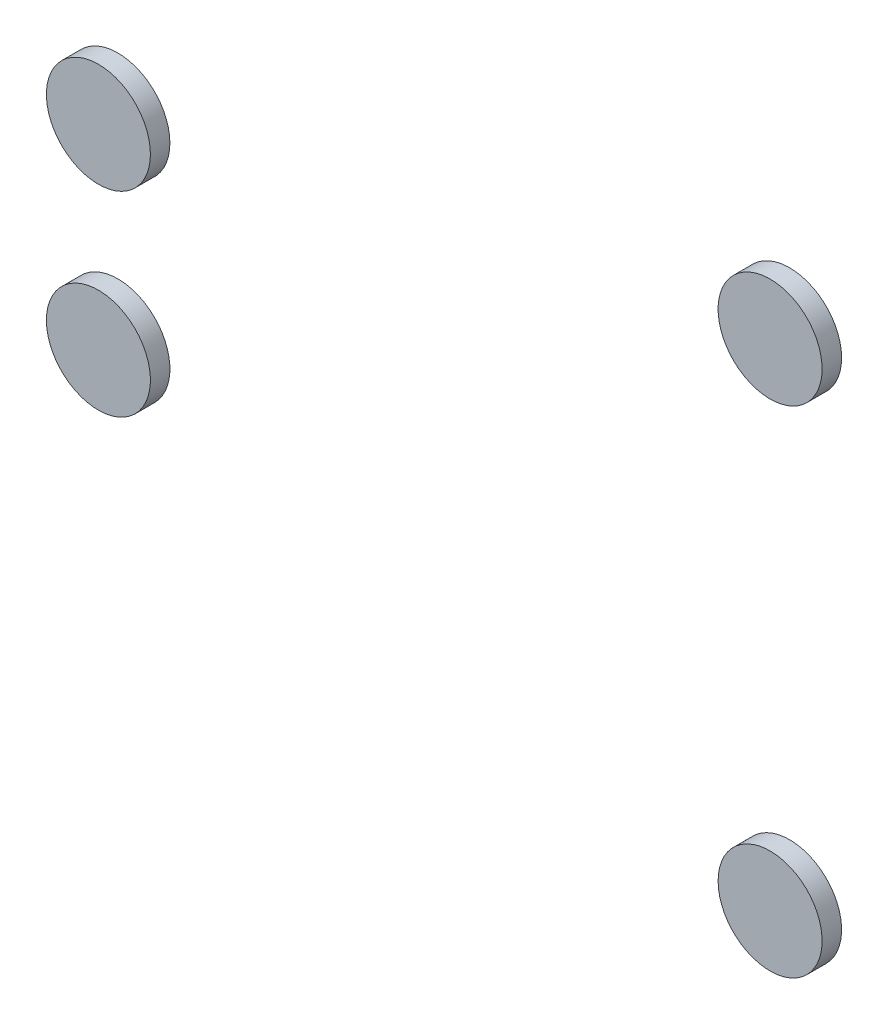
ISO-10303-21;
HEADER;
FILE_DESCRIPTION(('STEP AP214'),'2;1');
FILE_NAME('part.step','',(''),(''),'','','');
FILE_SCHEMA(('AUTOMOTIVE_DESIGN { 1 0 10303 214 1 1 1 1 }'));
ENDSEC;
DATA;
#1=APPLICATION_CONTEXT('core data for automotive mechanical design processes');
#2=APPLICATION_PROTOCOL_DEFINITION('international standard','automotive_design',2000,#1);
#3=PRODUCT_CONTEXT('',#1,'mechanical');
#4=PRODUCT('Part','Part','',(#3));
#5=PRODUCT_RELATED_PRODUCT_CATEGORY('part','',(#4));
#6=PRODUCT_DEFINITION_FORMATION('','',#4);
#7=PRODUCT_DEFINITION_CONTEXT('part definition',#1,'design');
#8=PRODUCT_DEFINITION('design','',#6,#7);
#9=PRODUCT_DEFINITION_SHAPE('','',#8);
#10=(LENGTH_UNIT() NAMED_UNIT(*) SI_UNIT(.MILLI.,.METRE.));
#11=(NAMED_UNIT(*) PLANE_ANGLE_UNIT() SI_UNIT($,.RADIAN.));
#12=(NAMED_UNIT(*) SI_UNIT($,.STERADIAN.) SOLID_ANGLE_UNIT());
#13=UNCERTAINTY_MEASURE_WITH_UNIT(LENGTH_MEASURE(1.E-05),#10,'distance_accuracy_value','');
#14=(GEOMETRIC_REPRESENTATION_CONTEXT(3) GLOBAL_UNCERTAINTY_ASSIGNED_CONTEXT((#13)) GLOBAL_UNIT_ASSIGNED_CONTEXT((#10,
#11,#12)) REPRESENTATION_CONTEXT('',''));
#15=CARTESIAN_POINT('',(0.,0.,0.));
#16=DIRECTION('',(0.,0.,1.));
#17=DIRECTION('',(1.,0.,0.));
#18=AXIS2_PLACEMENT_3D('',#15,#16,#17);
#19=CARTESIAN_POINT('',(-30.67323765729,-7.52444315316473,1.5));
#20=DIRECTION('',(0.,0.,-1.));
#21=DIRECTION('',(-1.,0.,0.));
#22=AXIS2_PLACEMENT_3D('',#19,#20,#21);
#23=CYLINDRICAL_SURFACE('',#22,4.);
#24=CARTESIAN_POINT('',(-30.67323765729,-7.52444315316473,1.5));
#25=DIRECTION('',(0.,0.,-1.));
#26=DIRECTION('',(-1.,0.,0.));
#27=AXIS2_PLACEMENT_3D('',#24,#25,#26);
#28=CIRCLE('',#27,4.);
#29=CARTESIAN_POINT('',(-34.67323765729,-7.52444315316473,1.5));
#30=VERTEX_POINT('',#29);
#31=EDGE_CURVE('E46',#30,#30,#28,.T.);
#32=ORIENTED_EDGE('',*,*,#31,.T.);
#33=EDGE_LOOP('',(#32));
#34=FACE_BOUND('',#33,.T.);
#35=CARTESIAN_POINT('',(-30.67323765729,-7.52444315316473,0.));
#36=DIRECTION('',(0.,0.,-1.));
#37=DIRECTION('',(-1.,0.,0.));
#38=AXIS2_PLACEMENT_3D('',#35,#36,#37);
#39=CIRCLE('',#38,4.);
#40=CARTESIAN_POINT('',(-34.67323765729,-7.52444315316473,0.));
#41=VERTEX_POINT('',#40);
#42=EDGE_CURVE('E11',#41,#41,#39,.T.);
#43=ORIENTED_EDGE('',*,*,#42,.F.);
#44=EDGE_LOOP('',(#43));
#45=FACE_BOUND('',#44,.T.);
#46=ADVANCED_FACE('F42',(#34,#45),#23,.T.);
#47=CARTESIAN_POINT('',(-30.67323765729,-7.52444315316473,1.5));
#48=DIRECTION('',(0.,0.,-1.));
#49=DIRECTION('',(-1.,0.,0.));
#50=AXIS2_PLACEMENT_3D('',#47,#48,#49);
#51=PLANE('',#50);
#52=ORIENTED_EDGE('',*,*,#31,.F.);
#53=EDGE_LOOP('',(#52));
#54=FACE_BOUND('',#53,.T.);
#55=ADVANCED_FACE('F44',(#54),#51,.F.);
#56=CARTESIAN_POINT('',(-30.67323765729,-7.52444315316473,0.));
#57=DIRECTION('',(0.,0.,-1.));
#58=DIRECTION('',(-1.,0.,0.));
#59=AXIS2_PLACEMENT_3D('',#56,#57,#58);
#60=PLANE('',#59);
#61=ORIENTED_EDGE('',*,*,#42,.T.);
#62=EDGE_LOOP('',(#61));
#63=FACE_BOUND('',#62,.T.);
#64=ADVANCED_FACE('F58',(#63),#60,.T.);
#65=CLOSED_SHELL('',(#46,#55,#64));
#66=MANIFOLD_SOLID_BREP('B2',#65);
#67=CARTESIAN_POINT('',(-30.67323765729,7.52444315316473,1.5));
#68=DIRECTION('',(0.,0.,-1.));
#69=DIRECTION('',(-1.,0.,0.));
#70=AXIS2_PLACEMENT_3D('',#67,#68,#69);
#71=CYLINDRICAL_SURFACE('',#70,4.);
#72=CARTESIAN_POINT('',(-30.67323765729,7.52444315316473,1.5));
#73=DIRECTION('',(0.,0.,1.));
#74=DIRECTION('',(1.,0.,0.));
#75=AXIS2_PLACEMENT_3D('',#72,#73,#74);
#76=CIRCLE('',#75,4.);
#77=CARTESIAN_POINT('',(-26.67323765729,7.52444315316473,1.5));
#78=VERTEX_POINT('',#77);
#79=EDGE_CURVE('E95',#78,#78,#76,.T.);
#80=ORIENTED_EDGE('',*,*,#79,.F.);
#81=EDGE_LOOP('',(#80));
#82=FACE_BOUND('',#81,.T.);
#83=CARTESIAN_POINT('',(-30.67323765729,7.52444315316473,0.));
#84=DIRECTION('',(0.,0.,1.));
#85=DIRECTION('',(1.,0.,0.));
#86=AXIS2_PLACEMENT_3D('',#83,#84,#85);
#87=CIRCLE('',#86,4.);
#88=CARTESIAN_POINT('',(-26.67323765729,7.52444315316473,0.));
#89=VERTEX_POINT('',#88);
#90=EDGE_CURVE('E41',#89,#89,#87,.T.);
#91=ORIENTED_EDGE('',*,*,#90,.T.);
#92=EDGE_LOOP('',(#91));
#93=FACE_BOUND('',#92,.T.);
#94=ADVANCED_FACE('F91',(#82,#93),#71,.T.);
#95=CARTESIAN_POINT('',(-30.67323765729,7.52444315316473,1.5));
#96=DIRECTION('',(0.,0.,1.));
#97=DIRECTION('',(1.,0.,0.));
#98=AXIS2_PLACEMENT_3D('',#95,#96,#97);
#99=PLANE('',#98);
#100=ORIENTED_EDGE('',*,*,#79,.T.);
#101=EDGE_LOOP('',(#100));
#102=FACE_BOUND('',#101,.T.);
#103=ADVANCED_FACE('F93',(#102),#99,.T.);
#104=CARTESIAN_POINT('',(-30.67323765729,7.52444315316473,0.));
#105=DIRECTION('',(0.,0.,1.));
#106=DIRECTION('',(1.,0.,0.));
#107=AXIS2_PLACEMENT_3D('',#104,#105,#106);
#108=PLANE('',#107);
#109=ORIENTED_EDGE('',*,*,#90,.F.);
#110=EDGE_LOOP('',(#109));
#111=FACE_BOUND('',#110,.T.);
#112=ADVANCED_FACE('F110',(#111),#108,.F.);
#113=CLOSED_SHELL('',(#94,#103,#112));
#114=MANIFOLD_SOLID_BREP('B6',#113);
#115=CARTESIAN_POINT('',(21.0000000000001,19.0525588832576,1.5));
#116=DIRECTION('',(0.,0.,-1.));
#117=DIRECTION('',(-1.,0.,0.));
#118=AXIS2_PLACEMENT_3D('',#115,#116,#117);
#119=CYLINDRICAL_SURFACE('',#118,4.);
#120=CARTESIAN_POINT('',(21.0000000000001,19.0525588832576,1.5));
#121=DIRECTION('',(0.,0.,1.));
#122=DIRECTION('',(1.,0.,0.));
#123=AXIS2_PLACEMENT_3D('',#120,#121,#122);
#124=CIRCLE('',#123,4.);
#125=CARTESIAN_POINT('',(25.0000000000001,19.0525588832576,1.5));
#126=VERTEX_POINT('',#125);
#127=EDGE_CURVE('E143',#126,#126,#124,.T.);
#128=ORIENTED_EDGE('',*,*,#127,.F.);
#129=EDGE_LOOP('',(#128));
#130=FACE_BOUND('',#129,.T.);
#131=CARTESIAN_POINT('',(21.0000000000001,19.0525588832576,0.));
#132=DIRECTION('',(0.,0.,1.));
#133=DIRECTION('',(1.,0.,0.));
#134=AXIS2_PLACEMENT_3D('',#131,#132,#133);
#135=CIRCLE('',#134,4.);
#136=CARTESIAN_POINT('',(25.0000000000001,19.0525588832576,0.));
#137=VERTEX_POINT('',#136);
#138=EDGE_CURVE('E90',#137,#137,#135,.T.);
#139=ORIENTED_EDGE('',*,*,#138,.T.);
#140=EDGE_LOOP('',(#139));
#141=FACE_BOUND('',#140,.T.);
#142=ADVANCED_FACE('F139',(#130,#141),#119,.T.);
#143=CARTESIAN_POINT('',(21.0000000000001,19.0525588832576,1.5));
#144=DIRECTION('',(0.,0.,1.));
#145=DIRECTION('',(1.,0.,0.));
#146=AXIS2_PLACEMENT_3D('',#143,#144,#145);
#147=PLANE('',#146);
#148=ORIENTED_EDGE('',*,*,#127,.T.);
#149=EDGE_LOOP('',(#148));
#150=FACE_BOUND('',#149,.T.);
#151=ADVANCED_FACE('F141',(#150),#147,.T.);
#152=CARTESIAN_POINT('',(21.0000000000001,19.0525588832576,0.));
#153=DIRECTION('',(0.,0.,1.));
#154=DIRECTION('',(1.,0.,0.));
#155=AXIS2_PLACEMENT_3D('',#152,#153,#154);
#156=PLANE('',#155);
#157=ORIENTED_EDGE('',*,*,#138,.F.);
#158=EDGE_LOOP('',(#157));
#159=FACE_BOUND('',#158,.T.);
#160=ADVANCED_FACE('F158',(#159),#156,.F.);
#161=CLOSED_SHELL('',(#142,#151,#160));
#162=MANIFOLD_SOLID_BREP('B36',#161);
#163=CARTESIAN_POINT('',(21.0000000000001,-19.0525588832576,1.5));
#164=DIRECTION('',(0.,0.,-1.));
#165=DIRECTION('',(-1.,0.,0.));
#166=AXIS2_PLACEMENT_3D('',#163,#164,#165);
#167=CYLINDRICAL_SURFACE('',#166,4.);
#168=CARTESIAN_POINT('',(21.0000000000001,-19.0525588832576,1.5));
#169=DIRECTION('',(0.,0.,-1.));
#170=DIRECTION('',(-1.,0.,0.));
#171=AXIS2_PLACEMENT_3D('',#168,#169,#170);
#172=CIRCLE('',#171,4.);
#173=CARTESIAN_POINT('',(17.0000000000001,-19.0525588832576,1.5));
#174=VERTEX_POINT('',#173);
#175=EDGE_CURVE('E138',#174,#174,#172,.T.);
#176=ORIENTED_EDGE('',*,*,#175,.T.);
#177=EDGE_LOOP('',(#176));
#178=FACE_BOUND('',#177,.T.);
#179=CARTESIAN_POINT('',(21.0000000000001,-19.0525588832576,0.));
#180=DIRECTION('',(0.,0.,-1.));
#181=DIRECTION('',(-1.,0.,0.));
#182=AXIS2_PLACEMENT_3D('',#179,#180,#181);
#183=CIRCLE('',#182,4.);
#184=CARTESIAN_POINT('',(17.0000000000001,-19.0525588832576,0.));
#185=VERTEX_POINT('',#184);
#186=EDGE_CURVE('E183',#185,#185,#183,.T.);
#187=ORIENTED_EDGE('',*,*,#186,.F.);
#188=EDGE_LOOP('',(#187));
#189=FACE_BOUND('',#188,.T.);
#190=ADVANCED_FACE('F180',(#178,#189),#167,.T.);
#191=CARTESIAN_POINT('',(21.0000000000001,-19.0525588832576,1.5));
#192=DIRECTION('',(0.,0.,-1.));
#193=DIRECTION('',(-1.,0.,0.));
#194=AXIS2_PLACEMENT_3D('',#191,#192,#193);
#195=PLANE('',#194);
#196=ORIENTED_EDGE('',*,*,#175,.F.);
#197=EDGE_LOOP('',(#196));
#198=FACE_BOUND('',#197,.T.);
#199=ADVANCED_FACE('F195',(#198),#195,.F.);
#200=CARTESIAN_POINT('',(21.0000000000001,-19.0525588832576,0.));
#201=DIRECTION('',(0.,0.,-1.));
#202=DIRECTION('',(-1.,0.,0.));
#203=AXIS2_PLACEMENT_3D('',#200,#201,#202);
#204=PLANE('',#203);
#205=ORIENTED_EDGE('',*,*,#186,.T.);
#206=EDGE_LOOP('',(#205));
#207=FACE_BOUND('',#206,.T.);
#208=ADVANCED_FACE('F192',(#207),#204,.T.);
#209=CLOSED_SHELL('',(#190,#199,#208));
#210=MANIFOLD_SOLID_BREP('B85',#209);
#211=ADVANCED_BREP_SHAPE_REPRESENTATION('',(#18,#66,#114,#162,#210),#14);
#212=SHAPE_DEFINITION_REPRESENTATION(#9,#211);
ENDSEC;
END-ISO-10303-21;
